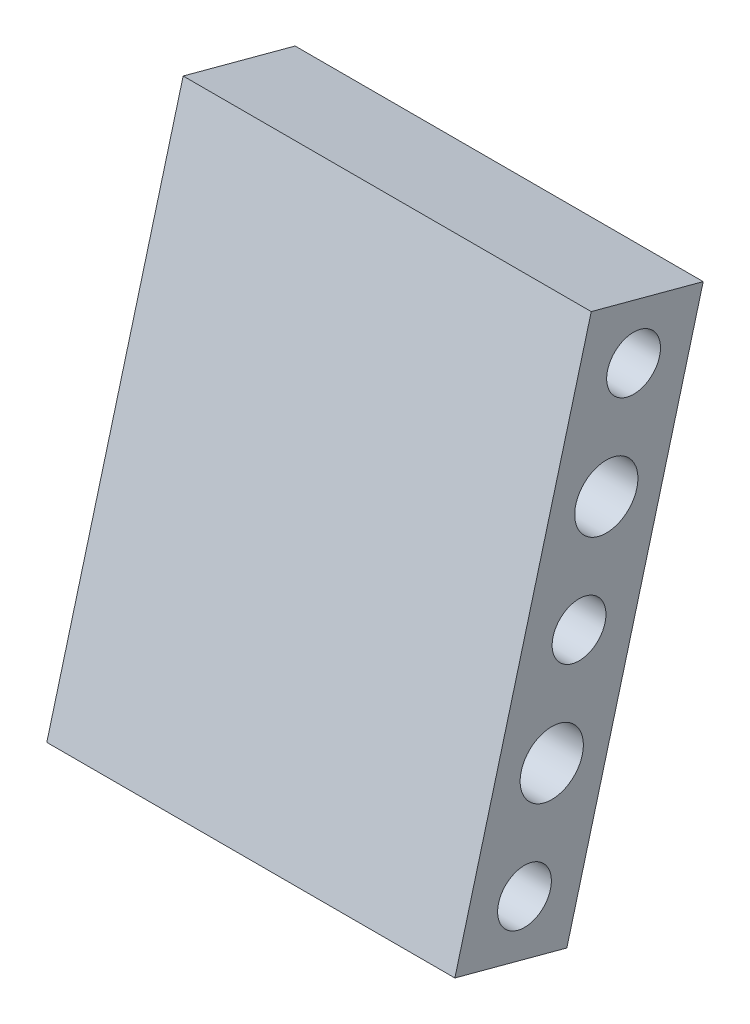
ISO-10303-21;
HEADER;
FILE_DESCRIPTION(('STEP AP214'),'2;1');
FILE_NAME('part.step','',(''),(''),'','','');
FILE_SCHEMA(('AUTOMOTIVE_DESIGN { 1 0 10303 214 1 1 1 1 }'));
ENDSEC;
DATA;
#1=APPLICATION_CONTEXT('core data for automotive mechanical design processes');
#2=APPLICATION_PROTOCOL_DEFINITION('international standard','automotive_design',2000,#1);
#3=PRODUCT_CONTEXT('',#1,'mechanical');
#4=PRODUCT('Part','Part','',(#3));
#5=PRODUCT_RELATED_PRODUCT_CATEGORY('part','',(#4));
#6=PRODUCT_DEFINITION_FORMATION('','',#4);
#7=PRODUCT_DEFINITION_CONTEXT('part definition',#1,'design');
#8=PRODUCT_DEFINITION('design','',#6,#7);
#9=PRODUCT_DEFINITION_SHAPE('','',#8);
#10=(LENGTH_UNIT() NAMED_UNIT(*) SI_UNIT(.MILLI.,.METRE.));
#11=(NAMED_UNIT(*) PLANE_ANGLE_UNIT() SI_UNIT($,.RADIAN.));
#12=(NAMED_UNIT(*) SI_UNIT($,.STERADIAN.) SOLID_ANGLE_UNIT());
#13=UNCERTAINTY_MEASURE_WITH_UNIT(LENGTH_MEASURE(1.E-05),#10,'distance_accuracy_value','');
#14=(GEOMETRIC_REPRESENTATION_CONTEXT(3) GLOBAL_UNCERTAINTY_ASSIGNED_CONTEXT((#13)) GLOBAL_UNIT_ASSIGNED_CONTEXT((#10,
#11,#12)) REPRESENTATION_CONTEXT('',''));
#15=CARTESIAN_POINT('',(0.,0.,0.));
#16=DIRECTION('',(0.,0.,1.));
#17=DIRECTION('',(1.,0.,0.));
#18=AXIS2_PLACEMENT_3D('',#15,#16,#17);
#19=CARTESIAN_POINT('',(19.3625,73.95167597594,-10.5849686406559));
#20=DIRECTION('',(0.,0.258819045102521,0.965925826289068));
#21=DIRECTION('',(0.,-0.965925826289068,0.258819045102521));
#22=AXIS2_PLACEMENT_3D('',#19,#20,#21);
#23=PLANE('',#22);
#24=DIRECTION('',(0.,0.965925826289068,-0.258819045102521));
#25=VECTOR('',#24,1.);
#26=CARTESIAN_POINT('',(-19.3625,73.95167597594,-10.5849686406559));
#27=LINE('',#26,#25);
#28=CARTESIAN_POINT('',(-19.3625,73.95167597594,-10.5849686406559));
#29=VERTEX_POINT('',#28);
#30=CARTESIAN_POINT('',(-19.3625,122.247967290393,-23.5259208957819));
#31=VERTEX_POINT('',#30);
#32=EDGE_CURVE('E161',#29,#31,#27,.T.);
#33=ORIENTED_EDGE('',*,*,#32,.F.);
#34=DIRECTION('',(-1.,0.,0.));
#35=VECTOR('',#34,1.);
#36=CARTESIAN_POINT('',(19.3625,73.95167597594,-10.5849686406559));
#37=LINE('',#36,#35);
#38=CARTESIAN_POINT('',(19.3625,73.95167597594,-10.5849686406559));
#39=VERTEX_POINT('',#38);
#40=EDGE_CURVE('E11',#39,#29,#37,.T.);
#41=ORIENTED_EDGE('',*,*,#40,.F.);
#42=DIRECTION('',(0.,0.965925826289068,-0.258819045102521));
#43=VECTOR('',#42,1.);
#44=CARTESIAN_POINT('',(19.3625,73.95167597594,-10.5849686406559));
#45=LINE('',#44,#43);
#46=CARTESIAN_POINT('',(19.3625,122.247967290393,-23.5259208957819));
#47=VERTEX_POINT('',#46);
#48=EDGE_CURVE('E162',#39,#47,#45,.T.);
#49=ORIENTED_EDGE('',*,*,#48,.T.);
#50=DIRECTION('',(-1.,0.,0.));
#51=VECTOR('',#50,1.);
#52=CARTESIAN_POINT('',(19.3625,122.247967290393,-23.5259208957819));
#53=LINE('',#52,#51);
#54=EDGE_CURVE('E93',#47,#31,#53,.T.);
#55=ORIENTED_EDGE('',*,*,#54,.T.);
#56=EDGE_LOOP('',(#33,#41,#49,#55));
#57=FACE_BOUND('',#56,.T.);
#58=ADVANCED_FACE('F49',(#57),#23,.T.);
#59=CARTESIAN_POINT('',(19.3625,71.1046664798122,-21.2101527298356));
#60=DIRECTION('',(0.,-0.965925826289069,0.25881904510252));
#61=DIRECTION('',(0.,-0.25881904510252,-0.965925826289069));
#62=AXIS2_PLACEMENT_3D('',#59,#60,#61);
#63=PLANE('',#62);
#64=DIRECTION('',(0.,0.25881904510252,0.965925826289069));
#65=VECTOR('',#64,1.);
#66=CARTESIAN_POINT('',(-19.3625,71.1046664798122,-21.2101527298356));
#67=LINE('',#66,#65);
#68=CARTESIAN_POINT('',(-19.3625,71.1046664798122,-21.2101527298356));
#69=VERTEX_POINT('',#68);
#70=EDGE_CURVE('E165',#69,#29,#67,.T.);
#71=ORIENTED_EDGE('',*,*,#70,.F.);
#72=DIRECTION('',(-1.,0.,0.));
#73=VECTOR('',#72,1.);
#74=CARTESIAN_POINT('',(19.3625,71.1046664798122,-21.2101527298356));
#75=LINE('',#74,#73);
#76=CARTESIAN_POINT('',(19.3625,71.1046664798122,-21.2101527298356));
#77=VERTEX_POINT('',#76);
#78=EDGE_CURVE('E58',#77,#69,#75,.T.);
#79=ORIENTED_EDGE('',*,*,#78,.F.);
#80=DIRECTION('',(0.,0.25881904510252,0.965925826289069));
#81=VECTOR('',#80,1.);
#82=CARTESIAN_POINT('',(19.3625,71.1046664798122,-21.2101527298356));
#83=LINE('',#82,#81);
#84=EDGE_CURVE('E169',#77,#39,#83,.T.);
#85=ORIENTED_EDGE('',*,*,#84,.T.);
#86=ORIENTED_EDGE('',*,*,#40,.T.);
#87=EDGE_LOOP('',(#71,#79,#85,#86));
#88=FACE_BOUND('',#87,.T.);
#89=ADVANCED_FACE('F213',(#88),#63,.T.);
#90=CARTESIAN_POINT('',(19.3625,119.400957794266,-34.1511049849617));
#91=DIRECTION('',(0.,-0.258819045102521,-0.965925826289068));
#92=DIRECTION('',(0.,0.965925826289068,-0.258819045102521));
#93=AXIS2_PLACEMENT_3D('',#90,#91,#92);
#94=PLANE('',#93);
#95=DIRECTION('',(0.,-0.965925826289068,0.258819045102521));
#96=VECTOR('',#95,1.);
#97=CARTESIAN_POINT('',(-19.3625,119.400957794266,-34.1511049849617));
#98=LINE('',#97,#96);
#99=CARTESIAN_POINT('',(-19.3625,119.400957794266,-34.1511049849617));
#100=VERTEX_POINT('',#99);
#101=EDGE_CURVE('E176',#100,#69,#98,.T.);
#102=ORIENTED_EDGE('',*,*,#101,.F.);
#103=DIRECTION('',(-1.,0.,0.));
#104=VECTOR('',#103,1.);
#105=CARTESIAN_POINT('',(19.3625,119.400957794266,-34.1511049849617));
#106=LINE('',#105,#104);
#107=CARTESIAN_POINT('',(19.3625,119.400957794266,-34.1511049849617));
#108=VERTEX_POINT('',#107);
#109=EDGE_CURVE('E181',#108,#100,#106,.T.);
#110=ORIENTED_EDGE('',*,*,#109,.F.);
#111=DIRECTION('',(0.,-0.965925826289068,0.258819045102521));
#112=VECTOR('',#111,1.);
#113=CARTESIAN_POINT('',(19.3625,119.400957794266,-34.1511049849617));
#114=LINE('',#113,#112);
#115=EDGE_CURVE('E167',#108,#77,#114,.T.);
#116=ORIENTED_EDGE('',*,*,#115,.T.);
#117=ORIENTED_EDGE('',*,*,#78,.T.);
#118=EDGE_LOOP('',(#102,#110,#116,#117));
#119=FACE_BOUND('',#118,.T.);
#120=ADVANCED_FACE('F214',(#119),#94,.T.);
#121=CARTESIAN_POINT('',(19.3625,122.247967290393,-23.5259208957819));
#122=DIRECTION('',(0.,0.965925826289069,-0.258819045102519));
#123=DIRECTION('',(0.,0.258819045102519,0.965925826289069));
#124=AXIS2_PLACEMENT_3D('',#121,#122,#123);
#125=PLANE('',#124);
#126=DIRECTION('',(0.,-0.258819045102519,-0.965925826289069));
#127=VECTOR('',#126,1.);
#128=CARTESIAN_POINT('',(-19.3625,122.247967290393,-23.5259208957819));
#129=LINE('',#128,#127);
#130=EDGE_CURVE('E173',#31,#100,#129,.T.);
#131=ORIENTED_EDGE('',*,*,#130,.F.);
#132=ORIENTED_EDGE('',*,*,#54,.F.);
#133=DIRECTION('',(0.,-0.258819045102519,-0.965925826289069));
#134=VECTOR('',#133,1.);
#135=CARTESIAN_POINT('',(19.3625,122.247967290393,-23.5259208957819));
#136=LINE('',#135,#134);
#137=EDGE_CURVE('E164',#47,#108,#136,.T.);
#138=ORIENTED_EDGE('',*,*,#137,.T.);
#139=ORIENTED_EDGE('',*,*,#109,.T.);
#140=EDGE_LOOP('',(#131,#132,#138,#139));
#141=FACE_BOUND('',#140,.T.);
#142=ADVANCED_FACE('F202',(#141),#125,.T.);
#143=CARTESIAN_POINT('',(19.3625,0.,0.));
#144=DIRECTION('',(-1.,0.,0.));
#145=DIRECTION('',(0.,0.,1.));
#146=AXIS2_PLACEMENT_3D('',#143,#144,#145);
#147=PLANE('',#146);
#148=CARTESIAN_POINT('',(19.3625,106.335575147993,-24.956227263834));
#149=DIRECTION('',(1.,0.,0.));
#150=DIRECTION('',(0.,0.,-1.));
#151=AXIS2_PLACEMENT_3D('',#148,#149,#150);
#152=CIRCLE('',#151,2.99999999999999);
#153=CARTESIAN_POINT('',(19.3625,106.335575147993,-27.956227263834));
#154=VERTEX_POINT('',#153);
#155=EDGE_CURVE('E191',#154,#154,#152,.T.);
#156=ORIENTED_EDGE('',*,*,#155,.F.);
#157=EDGE_LOOP('',(#156));
#158=FACE_BOUND('',#157,.T.);
#159=CARTESIAN_POINT('',(19.3625,87.0170586222121,-19.7798463617836));
#160=DIRECTION('',(1.,0.,0.));
#161=DIRECTION('',(0.,0.,-1.));
#162=AXIS2_PLACEMENT_3D('',#159,#160,#161);
#163=CIRCLE('',#162,2.99999999999999);
#164=CARTESIAN_POINT('',(19.3625,87.0170586222121,-22.7798463617836));
#165=VERTEX_POINT('',#164);
#166=EDGE_CURVE('E184',#165,#165,#163,.T.);
#167=ORIENTED_EDGE('',*,*,#166,.F.);
#168=EDGE_LOOP('',(#167));
#169=FACE_BOUND('',#168,.T.);
#170=CARTESIAN_POINT('',(19.3625,115.994833410884,-27.5444177148592));
#171=DIRECTION('',(1.,0.,0.));
#172=DIRECTION('',(0.,0.,-1.));
#173=AXIS2_PLACEMENT_3D('',#170,#171,#172);
#174=CIRCLE('',#173,2.55269999999999);
#175=CARTESIAN_POINT('',(19.3625,115.994833410884,-30.0971177148592));
#176=VERTEX_POINT('',#175);
#177=EDGE_CURVE('E143',#176,#176,#174,.T.);
#178=ORIENTED_EDGE('',*,*,#177,.F.);
#179=EDGE_LOOP('',(#178));
#180=FACE_BOUND('',#179,.T.);
#181=CARTESIAN_POINT('',(19.3625,96.6763168851028,-22.3680368128088));
#182=DIRECTION('',(1.,0.,0.));
#183=DIRECTION('',(0.,0.,-1.));
#184=AXIS2_PLACEMENT_3D('',#181,#182,#183);
#185=CIRCLE('',#184,2.55269999999999);
#186=CARTESIAN_POINT('',(19.3625,96.6763168851028,-24.9207368128088));
#187=VERTEX_POINT('',#186);
#188=EDGE_CURVE('E149',#187,#187,#185,.T.);
#189=ORIENTED_EDGE('',*,*,#188,.F.);
#190=EDGE_LOOP('',(#189));
#191=FACE_BOUND('',#190,.T.);
#192=CARTESIAN_POINT('',(19.3625,77.3578003593214,-17.1916559107584));
#193=DIRECTION('',(1.,0.,0.));
#194=DIRECTION('',(0.,0.,-1.));
#195=AXIS2_PLACEMENT_3D('',#192,#193,#194);
#196=CIRCLE('',#195,2.55269999999999);
#197=CARTESIAN_POINT('',(19.3625,77.3578003593214,-19.7443559107583));
#198=VERTEX_POINT('',#197);
#199=EDGE_CURVE('E155',#198,#198,#196,.T.);
#200=ORIENTED_EDGE('',*,*,#199,.F.);
#201=EDGE_LOOP('',(#200));
#202=FACE_BOUND('',#201,.T.);
#203=ORIENTED_EDGE('',*,*,#48,.F.);
#204=ORIENTED_EDGE('',*,*,#84,.F.);
#205=ORIENTED_EDGE('',*,*,#115,.F.);
#206=ORIENTED_EDGE('',*,*,#137,.F.);
#207=EDGE_LOOP('',(#203,#204,#205,#206));
#208=FACE_BOUND('',#207,.T.);
#209=ADVANCED_FACE('F198',(#158,#169,#180,#191,#202,#208),#147,.F.);
#210=CARTESIAN_POINT('',(-19.3625,0.,0.));
#211=DIRECTION('',(-1.,0.,0.));
#212=DIRECTION('',(0.,0.,1.));
#213=AXIS2_PLACEMENT_3D('',#210,#211,#212);
#214=PLANE('',#213);
#215=CARTESIAN_POINT('',(-19.3625,106.335575147993,-24.956227263834));
#216=DIRECTION('',(-1.,0.,0.));
#217=DIRECTION('',(0.,0.,1.));
#218=AXIS2_PLACEMENT_3D('',#215,#216,#217);
#219=CIRCLE('',#218,2.99999999999999);
#220=CARTESIAN_POINT('',(-19.3625,106.335575147993,-21.956227263834));
#221=VERTEX_POINT('',#220);
#222=EDGE_CURVE('E52',#221,#221,#219,.T.);
#223=ORIENTED_EDGE('',*,*,#222,.F.);
#224=EDGE_LOOP('',(#223));
#225=FACE_BOUND('',#224,.T.);
#226=CARTESIAN_POINT('',(-19.3625,87.0170586222121,-19.7798463617836));
#227=DIRECTION('',(-1.,0.,0.));
#228=DIRECTION('',(0.,0.,1.));
#229=AXIS2_PLACEMENT_3D('',#226,#227,#228);
#230=CIRCLE('',#229,2.99999999999999);
#231=CARTESIAN_POINT('',(-19.3625,87.0170586222121,-16.7798463617836));
#232=VERTEX_POINT('',#231);
#233=EDGE_CURVE('E131',#232,#232,#230,.T.);
#234=ORIENTED_EDGE('',*,*,#233,.F.);
#235=EDGE_LOOP('',(#234));
#236=FACE_BOUND('',#235,.T.);
#237=CARTESIAN_POINT('',(-19.3625,115.994833410884,-27.5444177148592));
#238=DIRECTION('',(-1.,0.,0.));
#239=DIRECTION('',(0.,0.,1.));
#240=AXIS2_PLACEMENT_3D('',#237,#238,#239);
#241=CIRCLE('',#240,2.55269999999999);
#242=CARTESIAN_POINT('',(-19.3625,115.994833410884,-24.9917177148592));
#243=VERTEX_POINT('',#242);
#244=EDGE_CURVE('E125',#243,#243,#241,.T.);
#245=ORIENTED_EDGE('',*,*,#244,.F.);
#246=EDGE_LOOP('',(#245));
#247=FACE_BOUND('',#246,.T.);
#248=CARTESIAN_POINT('',(-19.3625,96.6763168851028,-22.3680368128088));
#249=DIRECTION('',(-1.,0.,0.));
#250=DIRECTION('',(0.,0.,1.));
#251=AXIS2_PLACEMENT_3D('',#248,#249,#250);
#252=CIRCLE('',#251,2.55269999999999);
#253=CARTESIAN_POINT('',(-19.3625,96.6763168851028,-19.8153368128088));
#254=VERTEX_POINT('',#253);
#255=EDGE_CURVE('E124',#254,#254,#252,.T.);
#256=ORIENTED_EDGE('',*,*,#255,.F.);
#257=EDGE_LOOP('',(#256));
#258=FACE_BOUND('',#257,.T.);
#259=CARTESIAN_POINT('',(-19.3625,77.3578003593214,-17.1916559107584));
#260=DIRECTION('',(-1.,0.,0.));
#261=DIRECTION('',(0.,0.,1.));
#262=AXIS2_PLACEMENT_3D('',#259,#260,#261);
#263=CIRCLE('',#262,2.55269999999999);
#264=CARTESIAN_POINT('',(-19.3625,77.3578003593214,-14.6389559107584));
#265=VERTEX_POINT('',#264);
#266=EDGE_CURVE('E137',#265,#265,#263,.T.);
#267=ORIENTED_EDGE('',*,*,#266,.F.);
#268=EDGE_LOOP('',(#267));
#269=FACE_BOUND('',#268,.T.);
#270=ORIENTED_EDGE('',*,*,#32,.T.);
#271=ORIENTED_EDGE('',*,*,#130,.T.);
#272=ORIENTED_EDGE('',*,*,#101,.T.);
#273=ORIENTED_EDGE('',*,*,#70,.T.);
#274=EDGE_LOOP('',(#270,#271,#272,#273));
#275=FACE_BOUND('',#274,.T.);
#276=ADVANCED_FACE('F201',(#225,#236,#247,#258,#269,#275),#214,.T.);
#277=CARTESIAN_POINT('',(2.8525,77.3578003593214,-17.1916559107584));
#278=DIRECTION('',(1.,0.,0.));
#279=DIRECTION('',(0.,0.,-1.));
#280=AXIS2_PLACEMENT_3D('',#277,#278,#279);
#281=CONICAL_SURFACE('',#280,2.55269999999999,1.02974425867665);
#282=CARTESIAN_POINT('',(1.31868309780835,77.3578003593214,-17.1916559107584));
#283=VERTEX_POINT('',#282);
#284=VERTEX_LOOP('',#283);
#285=FACE_BOUND('',#284,.T.);
#286=CARTESIAN_POINT('',(2.8525,77.3578003593214,-17.1916559107584));
#287=DIRECTION('',(1.,0.,0.));
#288=DIRECTION('',(0.,0.,-1.));
#289=AXIS2_PLACEMENT_3D('',#286,#287,#288);
#290=CIRCLE('',#289,2.55269999999999);
#291=CARTESIAN_POINT('',(2.8525,77.3578003593214,-19.7443559107583));
#292=VERTEX_POINT('',#291);
#293=EDGE_CURVE('E158',#292,#292,#290,.T.);
#294=ORIENTED_EDGE('',*,*,#293,.T.);
#295=EDGE_LOOP('',(#294));
#296=FACE_BOUND('',#295,.T.);
#297=ADVANCED_FACE('F252',(#285,#296),#281,.F.);
#298=CARTESIAN_POINT('',(19.3625,77.3578003593214,-17.1916559107584));
#299=DIRECTION('',(1.,0.,0.));
#300=DIRECTION('',(0.,0.,-1.));
#301=AXIS2_PLACEMENT_3D('',#298,#299,#300);
#302=CYLINDRICAL_SURFACE('',#301,2.55269999999999);
#303=ORIENTED_EDGE('',*,*,#293,.F.);
#304=EDGE_LOOP('',(#303));
#305=FACE_BOUND('',#304,.T.);
#306=ORIENTED_EDGE('',*,*,#199,.T.);
#307=EDGE_LOOP('',(#306));
#308=FACE_BOUND('',#307,.T.);
#309=ADVANCED_FACE('F263',(#305,#308),#302,.F.);
#310=CARTESIAN_POINT('',(2.8525,96.6763168851028,-22.3680368128088));
#311=DIRECTION('',(1.,0.,0.));
#312=DIRECTION('',(0.,0.,-1.));
#313=AXIS2_PLACEMENT_3D('',#310,#311,#312);
#314=CONICAL_SURFACE('',#313,2.55269999999999,1.02974425867665);
#315=CARTESIAN_POINT('',(1.31868309780835,96.6763168851028,-22.3680368128088));
#316=VERTEX_POINT('',#315);
#317=VERTEX_LOOP('',#316);
#318=FACE_BOUND('',#317,.T.);
#319=CARTESIAN_POINT('',(2.8525,96.6763168851028,-22.3680368128088));
#320=DIRECTION('',(1.,0.,0.));
#321=DIRECTION('',(0.,0.,-1.));
#322=AXIS2_PLACEMENT_3D('',#319,#320,#321);
#323=CIRCLE('',#322,2.55269999999999);
#324=CARTESIAN_POINT('',(2.8525,96.6763168851028,-24.9207368128088));
#325=VERTEX_POINT('',#324);
#326=EDGE_CURVE('E152',#325,#325,#323,.T.);
#327=ORIENTED_EDGE('',*,*,#326,.T.);
#328=EDGE_LOOP('',(#327));
#329=FACE_BOUND('',#328,.T.);
#330=ADVANCED_FACE('F273',(#318,#329),#314,.F.);
#331=CARTESIAN_POINT('',(19.3625,96.6763168851028,-22.3680368128088));
#332=DIRECTION('',(1.,0.,0.));
#333=DIRECTION('',(0.,0.,-1.));
#334=AXIS2_PLACEMENT_3D('',#331,#332,#333);
#335=CYLINDRICAL_SURFACE('',#334,2.55269999999999);
#336=ORIENTED_EDGE('',*,*,#326,.F.);
#337=EDGE_LOOP('',(#336));
#338=FACE_BOUND('',#337,.T.);
#339=ORIENTED_EDGE('',*,*,#188,.T.);
#340=EDGE_LOOP('',(#339));
#341=FACE_BOUND('',#340,.T.);
#342=ADVANCED_FACE('F286',(#338,#341),#335,.F.);
#343=CARTESIAN_POINT('',(2.8525,115.994833410884,-27.5444177148592));
#344=DIRECTION('',(1.,0.,0.));
#345=DIRECTION('',(0.,0.,-1.));
#346=AXIS2_PLACEMENT_3D('',#343,#344,#345);
#347=CONICAL_SURFACE('',#346,2.55269999999999,1.02974425867665);
#348=CARTESIAN_POINT('',(1.31868309780835,115.994833410884,-27.5444177148592));
#349=VERTEX_POINT('',#348);
#350=VERTEX_LOOP('',#349);
#351=FACE_BOUND('',#350,.T.);
#352=CARTESIAN_POINT('',(2.8525,115.994833410884,-27.5444177148592));
#353=DIRECTION('',(1.,0.,0.));
#354=DIRECTION('',(0.,0.,-1.));
#355=AXIS2_PLACEMENT_3D('',#352,#353,#354);
#356=CIRCLE('',#355,2.55269999999999);
#357=CARTESIAN_POINT('',(2.8525,115.994833410884,-30.0971177148592));
#358=VERTEX_POINT('',#357);
#359=EDGE_CURVE('E146',#358,#358,#356,.T.);
#360=ORIENTED_EDGE('',*,*,#359,.T.);
#361=EDGE_LOOP('',(#360));
#362=FACE_BOUND('',#361,.T.);
#363=ADVANCED_FACE('F297',(#351,#362),#347,.F.);
#364=CARTESIAN_POINT('',(19.3625,115.994833410884,-27.5444177148592));
#365=DIRECTION('',(1.,0.,0.));
#366=DIRECTION('',(0.,0.,-1.));
#367=AXIS2_PLACEMENT_3D('',#364,#365,#366);
#368=CYLINDRICAL_SURFACE('',#367,2.55269999999999);
#369=ORIENTED_EDGE('',*,*,#359,.F.);
#370=EDGE_LOOP('',(#369));
#371=FACE_BOUND('',#370,.T.);
#372=ORIENTED_EDGE('',*,*,#177,.T.);
#373=EDGE_LOOP('',(#372));
#374=FACE_BOUND('',#373,.T.);
#375=ADVANCED_FACE('F309',(#371,#374),#368,.F.);
#376=CARTESIAN_POINT('',(-2.8525,77.3578003593214,-17.1916559107584));
#377=DIRECTION('',(-1.,0.,0.));
#378=DIRECTION('',(0.,0.,1.));
#379=AXIS2_PLACEMENT_3D('',#376,#377,#378);
#380=CONICAL_SURFACE('',#379,2.55269999999999,1.02974425867665);
#381=CARTESIAN_POINT('',(-1.31868309780836,77.3578003593214,-17.1916559107584));
#382=VERTEX_POINT('',#381);
#383=VERTEX_LOOP('',#382);
#384=FACE_BOUND('',#383,.T.);
#385=CARTESIAN_POINT('',(-2.8525,77.3578003593214,-17.1916559107584));
#386=DIRECTION('',(-1.,0.,0.));
#387=DIRECTION('',(0.,0.,1.));
#388=AXIS2_PLACEMENT_3D('',#385,#386,#387);
#389=CIRCLE('',#388,2.55269999999999);
#390=CARTESIAN_POINT('',(-2.8525,77.3578003593214,-14.6389559107584));
#391=VERTEX_POINT('',#390);
#392=EDGE_CURVE('E140',#391,#391,#389,.T.);
#393=ORIENTED_EDGE('',*,*,#392,.T.);
#394=EDGE_LOOP('',(#393));
#395=FACE_BOUND('',#394,.T.);
#396=ADVANCED_FACE('F320',(#384,#395),#380,.F.);
#397=CARTESIAN_POINT('',(-19.3625,77.3578003593214,-17.1916559107584));
#398=DIRECTION('',(-1.,0.,0.));
#399=DIRECTION('',(0.,0.,1.));
#400=AXIS2_PLACEMENT_3D('',#397,#398,#399);
#401=CYLINDRICAL_SURFACE('',#400,2.55269999999999);
#402=ORIENTED_EDGE('',*,*,#392,.F.);
#403=EDGE_LOOP('',(#402));
#404=FACE_BOUND('',#403,.T.);
#405=ORIENTED_EDGE('',*,*,#266,.T.);
#406=EDGE_LOOP('',(#405));
#407=FACE_BOUND('',#406,.T.);
#408=ADVANCED_FACE('F331',(#404,#407),#401,.F.);
#409=CARTESIAN_POINT('',(-2.8525,96.6763168851028,-22.3680368128088));
#410=DIRECTION('',(-1.,0.,0.));
#411=DIRECTION('',(0.,0.,1.));
#412=AXIS2_PLACEMENT_3D('',#409,#410,#411);
#413=CONICAL_SURFACE('',#412,2.55269999999999,1.02974425867665);
#414=CARTESIAN_POINT('',(-1.31868309780836,96.6763168851028,-22.3680368128088));
#415=VERTEX_POINT('',#414);
#416=VERTEX_LOOP('',#415);
#417=FACE_BOUND('',#416,.T.);
#418=CARTESIAN_POINT('',(-2.8525,96.6763168851028,-22.3680368128088));
#419=DIRECTION('',(-1.,0.,0.));
#420=DIRECTION('',(0.,0.,1.));
#421=AXIS2_PLACEMENT_3D('',#418,#419,#420);
#422=CIRCLE('',#421,2.55269999999999);
#423=CARTESIAN_POINT('',(-2.8525,96.6763168851028,-19.8153368128088));
#424=VERTEX_POINT('',#423);
#425=EDGE_CURVE('E128',#424,#424,#422,.T.);
#426=ORIENTED_EDGE('',*,*,#425,.T.);
#427=EDGE_LOOP('',(#426));
#428=FACE_BOUND('',#427,.T.);
#429=ADVANCED_FACE('F342',(#417,#428),#413,.F.);
#430=CARTESIAN_POINT('',(-19.3625,96.6763168851028,-22.3680368128088));
#431=DIRECTION('',(-1.,0.,0.));
#432=DIRECTION('',(0.,0.,1.));
#433=AXIS2_PLACEMENT_3D('',#430,#431,#432);
#434=CYLINDRICAL_SURFACE('',#433,2.55269999999999);
#435=ORIENTED_EDGE('',*,*,#425,.F.);
#436=EDGE_LOOP('',(#435));
#437=FACE_BOUND('',#436,.T.);
#438=ORIENTED_EDGE('',*,*,#255,.T.);
#439=EDGE_LOOP('',(#438));
#440=FACE_BOUND('',#439,.T.);
#441=ADVANCED_FACE('F118',(#437,#440),#434,.F.);
#442=CARTESIAN_POINT('',(-2.8525,115.994833410884,-27.5444177148592));
#443=DIRECTION('',(-1.,0.,0.));
#444=DIRECTION('',(0.,0.,1.));
#445=AXIS2_PLACEMENT_3D('',#442,#443,#444);
#446=CONICAL_SURFACE('',#445,2.55269999999999,1.02974425867665);
#447=CARTESIAN_POINT('',(-1.31868309780836,115.994833410884,-27.5444177148592));
#448=VERTEX_POINT('',#447);
#449=VERTEX_LOOP('',#448);
#450=FACE_BOUND('',#449,.T.);
#451=CARTESIAN_POINT('',(-2.8525,115.994833410884,-27.5444177148592));
#452=DIRECTION('',(-1.,0.,0.));
#453=DIRECTION('',(0.,0.,1.));
#454=AXIS2_PLACEMENT_3D('',#451,#452,#453);
#455=CIRCLE('',#454,2.55269999999999);
#456=CARTESIAN_POINT('',(-2.8525,115.994833410884,-24.9917177148592));
#457=VERTEX_POINT('',#456);
#458=EDGE_CURVE('E122',#457,#457,#455,.T.);
#459=ORIENTED_EDGE('',*,*,#458,.T.);
#460=EDGE_LOOP('',(#459));
#461=FACE_BOUND('',#460,.T.);
#462=ADVANCED_FACE('F114',(#450,#461),#446,.F.);
#463=CARTESIAN_POINT('',(-19.3625,115.994833410884,-27.5444177148592));
#464=DIRECTION('',(-1.,0.,0.));
#465=DIRECTION('',(0.,0.,1.));
#466=AXIS2_PLACEMENT_3D('',#463,#464,#465);
#467=CYLINDRICAL_SURFACE('',#466,2.55269999999999);
#468=ORIENTED_EDGE('',*,*,#458,.F.);
#469=EDGE_LOOP('',(#468));
#470=FACE_BOUND('',#469,.T.);
#471=ORIENTED_EDGE('',*,*,#244,.T.);
#472=EDGE_LOOP('',(#471));
#473=FACE_BOUND('',#472,.T.);
#474=ADVANCED_FACE('F117',(#470,#473),#467,.F.);
#475=CARTESIAN_POINT('',(19.3625,87.0170586222121,-19.7798463617836));
#476=DIRECTION('',(1.,0.,0.));
#477=DIRECTION('',(0.,0.,-1.));
#478=AXIS2_PLACEMENT_3D('',#475,#476,#477);
#479=CYLINDRICAL_SURFACE('',#478,2.99999999999999);
#480=ORIENTED_EDGE('',*,*,#233,.T.);
#481=EDGE_LOOP('',(#480));
#482=FACE_BOUND('',#481,.T.);
#483=ORIENTED_EDGE('',*,*,#166,.T.);
#484=EDGE_LOOP('',(#483));
#485=FACE_BOUND('',#484,.T.);
#486=ADVANCED_FACE('F381',(#482,#485),#479,.F.);
#487=CARTESIAN_POINT('',(19.3625,106.335575147993,-24.956227263834));
#488=DIRECTION('',(1.,0.,0.));
#489=DIRECTION('',(0.,0.,-1.));
#490=AXIS2_PLACEMENT_3D('',#487,#488,#489);
#491=CYLINDRICAL_SURFACE('',#490,2.99999999999999);
#492=ORIENTED_EDGE('',*,*,#222,.T.);
#493=EDGE_LOOP('',(#492));
#494=FACE_BOUND('',#493,.T.);
#495=ORIENTED_EDGE('',*,*,#155,.T.);
#496=EDGE_LOOP('',(#495));
#497=FACE_BOUND('',#496,.T.);
#498=ADVANCED_FACE('F196',(#494,#497),#491,.F.);
#499=CLOSED_SHELL('',(#58,#89,#120,#142,#209,#276,#297,#309,#330,#342,#363,#375,#396,#408,#429,
#441,#462,#474,#486,#498));
#500=MANIFOLD_SOLID_BREP('B2',#499);
#501=ADVANCED_BREP_SHAPE_REPRESENTATION('',(#18,#500),#14);
#502=SHAPE_DEFINITION_REPRESENTATION(#9,#501);
ENDSEC;
END-ISO-10303-21;
